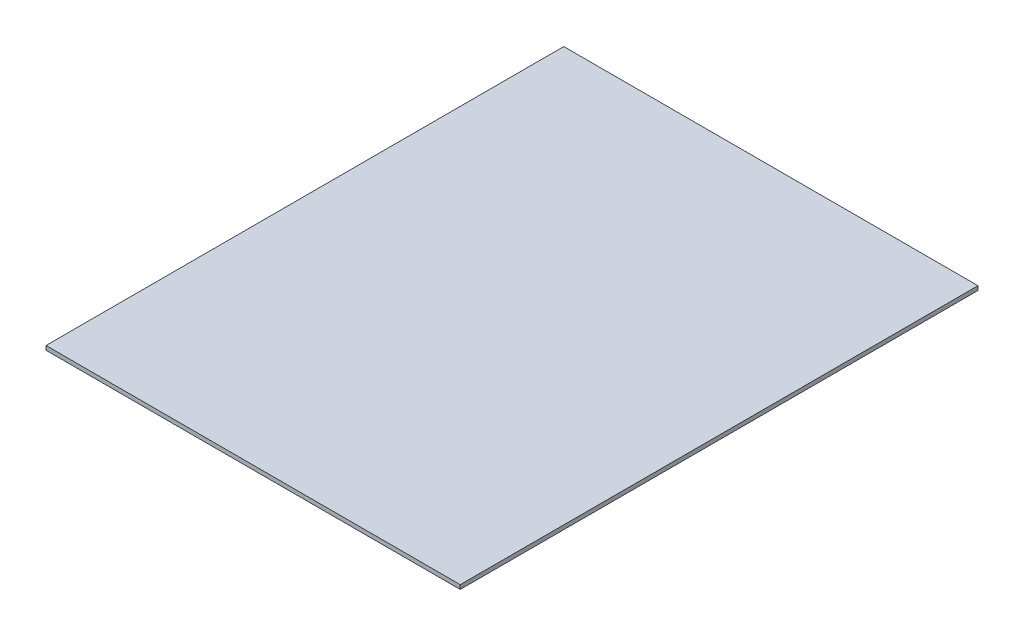
ISO-10303-21;
HEADER;
FILE_DESCRIPTION(('STEP AP214'),'2;1');
FILE_NAME('part.step','',(''),(''),'','','');
FILE_SCHEMA(('AUTOMOTIVE_DESIGN { 1 0 10303 214 1 1 1 1 }'));
ENDSEC;
DATA;
#1=APPLICATION_CONTEXT('core data for automotive mechanical design processes');
#2=APPLICATION_PROTOCOL_DEFINITION('international standard','automotive_design',2000,#1);
#3=PRODUCT_CONTEXT('',#1,'mechanical');
#4=PRODUCT('Part','Part','',(#3));
#5=PRODUCT_RELATED_PRODUCT_CATEGORY('part','',(#4));
#6=PRODUCT_DEFINITION_FORMATION('','',#4);
#7=PRODUCT_DEFINITION_CONTEXT('part definition',#1,'design');
#8=PRODUCT_DEFINITION('design','',#6,#7);
#9=PRODUCT_DEFINITION_SHAPE('','',#8);
#10=(LENGTH_UNIT() NAMED_UNIT(*) SI_UNIT(.MILLI.,.METRE.));
#11=(NAMED_UNIT(*) PLANE_ANGLE_UNIT() SI_UNIT($,.RADIAN.));
#12=(NAMED_UNIT(*) SI_UNIT($,.STERADIAN.) SOLID_ANGLE_UNIT());
#13=UNCERTAINTY_MEASURE_WITH_UNIT(LENGTH_MEASURE(1.E-05),#10,'distance_accuracy_value','');
#14=(GEOMETRIC_REPRESENTATION_CONTEXT(3) GLOBAL_UNCERTAINTY_ASSIGNED_CONTEXT((#13)) GLOBAL_UNIT_ASSIGNED_CONTEXT((#10,
#11,#12)) REPRESENTATION_CONTEXT('',''));
#15=CARTESIAN_POINT('',(0.,0.,0.));
#16=DIRECTION('',(0.,0.,1.));
#17=DIRECTION('',(1.,0.,0.));
#18=AXIS2_PLACEMENT_3D('',#15,#16,#17);
#19=CARTESIAN_POINT('',(150.,1166.,-560.));
#20=DIRECTION('',(-1.,0.,0.));
#21=DIRECTION('',(0.,0.,1.));
#22=AXIS2_PLACEMENT_3D('',#19,#20,#21);
#23=PLANE('',#22);
#24=DIRECTION('',(0.,-1.,0.));
#25=VECTOR('',#24,1.);
#26=CARTESIAN_POINT('',(150.,1166.,-60.));
#27=LINE('',#26,#25);
#28=CARTESIAN_POINT('',(150.,1170.,-60.));
#29=VERTEX_POINT('',#28);
#30=CARTESIAN_POINT('',(150.,1166.,-60.));
#31=VERTEX_POINT('',#30);
#32=EDGE_CURVE('E103',#29,#31,#27,.T.);
#33=ORIENTED_EDGE('',*,*,#32,.F.);
#34=DIRECTION('',(0.,0.,1.));
#35=VECTOR('',#34,1.);
#36=CARTESIAN_POINT('',(150.,1170.,-560.));
#37=LINE('',#36,#35);
#38=CARTESIAN_POINT('',(150.,1170.,-560.));
#39=VERTEX_POINT('',#38);
#40=EDGE_CURVE('E11',#39,#29,#37,.T.);
#41=ORIENTED_EDGE('',*,*,#40,.F.);
#42=DIRECTION('',(0.,-1.,0.));
#43=VECTOR('',#42,1.);
#44=CARTESIAN_POINT('',(150.,1166.,-560.));
#45=LINE('',#44,#43);
#46=CARTESIAN_POINT('',(150.,1166.,-560.));
#47=VERTEX_POINT('',#46);
#48=EDGE_CURVE('E97',#39,#47,#45,.T.);
#49=ORIENTED_EDGE('',*,*,#48,.T.);
#50=DIRECTION('',(0.,0.,1.));
#51=VECTOR('',#50,1.);
#52=CARTESIAN_POINT('',(150.,1166.,-560.));
#53=LINE('',#52,#51);
#54=EDGE_CURVE('E42',#47,#31,#53,.T.);
#55=ORIENTED_EDGE('',*,*,#54,.T.);
#56=EDGE_LOOP('',(#33,#41,#49,#55));
#57=FACE_BOUND('',#56,.T.);
#58=ADVANCED_FACE('F39',(#57),#23,.T.);
#59=CARTESIAN_POINT('',(150.,1170.,-560.));
#60=DIRECTION('',(0.,1.,0.));
#61=DIRECTION('',(0.,0.,1.));
#62=AXIS2_PLACEMENT_3D('',#59,#60,#61);
#63=PLANE('',#62);
#64=DIRECTION('',(-1.,0.,0.));
#65=VECTOR('',#64,1.);
#66=CARTESIAN_POINT('',(150.,1170.,-60.));
#67=LINE('',#66,#65);
#68=CARTESIAN_POINT('',(550.,1170.,-60.));
#69=VERTEX_POINT('',#68);
#70=EDGE_CURVE('E99',#69,#29,#67,.T.);
#71=ORIENTED_EDGE('',*,*,#70,.F.);
#72=DIRECTION('',(0.,0.,1.));
#73=VECTOR('',#72,1.);
#74=CARTESIAN_POINT('',(550.,1170.,-560.));
#75=LINE('',#74,#73);
#76=CARTESIAN_POINT('',(550.,1170.,-560.));
#77=VERTEX_POINT('',#76);
#78=EDGE_CURVE('E48',#77,#69,#75,.T.);
#79=ORIENTED_EDGE('',*,*,#78,.F.);
#80=DIRECTION('',(-1.,0.,0.));
#81=VECTOR('',#80,1.);
#82=CARTESIAN_POINT('',(150.,1170.,-560.));
#83=LINE('',#82,#81);
#84=EDGE_CURVE('E94',#77,#39,#83,.T.);
#85=ORIENTED_EDGE('',*,*,#84,.T.);
#86=ORIENTED_EDGE('',*,*,#40,.T.);
#87=EDGE_LOOP('',(#71,#79,#85,#86));
#88=FACE_BOUND('',#87,.T.);
#89=ADVANCED_FACE('F113',(#88),#63,.T.);
#90=CARTESIAN_POINT('',(550.,1166.,-560.));
#91=DIRECTION('',(1.,0.,0.));
#92=DIRECTION('',(0.,0.,-1.));
#93=AXIS2_PLACEMENT_3D('',#90,#91,#92);
#94=PLANE('',#93);
#95=DIRECTION('',(0.,1.,0.));
#96=VECTOR('',#95,1.);
#97=CARTESIAN_POINT('',(550.,1166.,-60.));
#98=LINE('',#97,#96);
#99=CARTESIAN_POINT('',(550.,1166.,-60.));
#100=VERTEX_POINT('',#99);
#101=EDGE_CURVE('E89',#100,#69,#98,.T.);
#102=ORIENTED_EDGE('',*,*,#101,.F.);
#103=DIRECTION('',(0.,0.,1.));
#104=VECTOR('',#103,1.);
#105=CARTESIAN_POINT('',(550.,1166.,-560.));
#106=LINE('',#105,#104);
#107=CARTESIAN_POINT('',(550.,1166.,-560.));
#108=VERTEX_POINT('',#107);
#109=EDGE_CURVE('E84',#108,#100,#106,.T.);
#110=ORIENTED_EDGE('',*,*,#109,.F.);
#111=DIRECTION('',(0.,1.,0.));
#112=VECTOR('',#111,1.);
#113=CARTESIAN_POINT('',(550.,1166.,-560.));
#114=LINE('',#113,#112);
#115=EDGE_CURVE('E87',#108,#77,#114,.T.);
#116=ORIENTED_EDGE('',*,*,#115,.T.);
#117=ORIENTED_EDGE('',*,*,#78,.T.);
#118=EDGE_LOOP('',(#102,#110,#116,#117));
#119=FACE_BOUND('',#118,.T.);
#120=ADVANCED_FACE('F86',(#119),#94,.T.);
#121=CARTESIAN_POINT('',(150.,1166.,-560.));
#122=DIRECTION('',(0.,-1.,0.));
#123=DIRECTION('',(0.,0.,-1.));
#124=AXIS2_PLACEMENT_3D('',#121,#122,#123);
#125=PLANE('',#124);
#126=DIRECTION('',(1.,0.,0.));
#127=VECTOR('',#126,1.);
#128=CARTESIAN_POINT('',(150.,1166.,-60.));
#129=LINE('',#128,#127);
#130=EDGE_CURVE('E106',#31,#100,#129,.T.);
#131=ORIENTED_EDGE('',*,*,#130,.F.);
#132=ORIENTED_EDGE('',*,*,#54,.F.);
#133=DIRECTION('',(1.,0.,0.));
#134=VECTOR('',#133,1.);
#135=CARTESIAN_POINT('',(150.,1166.,-560.));
#136=LINE('',#135,#134);
#137=EDGE_CURVE('E93',#47,#108,#136,.T.);
#138=ORIENTED_EDGE('',*,*,#137,.T.);
#139=ORIENTED_EDGE('',*,*,#109,.T.);
#140=EDGE_LOOP('',(#131,#132,#138,#139));
#141=FACE_BOUND('',#140,.T.);
#142=ADVANCED_FACE('F96',(#141),#125,.T.);
#143=CARTESIAN_POINT('',(0.,0.,-560.));
#144=DIRECTION('',(0.,0.,-1.));
#145=DIRECTION('',(-1.,0.,0.));
#146=AXIS2_PLACEMENT_3D('',#143,#144,#145);
#147=PLANE('',#146);
#148=ORIENTED_EDGE('',*,*,#48,.F.);
#149=ORIENTED_EDGE('',*,*,#84,.F.);
#150=ORIENTED_EDGE('',*,*,#115,.F.);
#151=ORIENTED_EDGE('',*,*,#137,.F.);
#152=EDGE_LOOP('',(#148,#149,#150,#151));
#153=FACE_BOUND('',#152,.T.);
#154=ADVANCED_FACE('F92',(#153),#147,.T.);
#155=CARTESIAN_POINT('',(0.,0.,-60.));
#156=DIRECTION('',(0.,0.,-1.));
#157=DIRECTION('',(-1.,0.,0.));
#158=AXIS2_PLACEMENT_3D('',#155,#156,#157);
#159=PLANE('',#158);
#160=ORIENTED_EDGE('',*,*,#32,.T.);
#161=ORIENTED_EDGE('',*,*,#130,.T.);
#162=ORIENTED_EDGE('',*,*,#101,.T.);
#163=ORIENTED_EDGE('',*,*,#70,.T.);
#164=EDGE_LOOP('',(#160,#161,#162,#163));
#165=FACE_BOUND('',#164,.T.);
#166=ADVANCED_FACE('F112',(#165),#159,.F.);
#167=CLOSED_SHELL('',(#58,#89,#120,#142,#154,#166));
#168=MANIFOLD_SOLID_BREP('B2',#167);
#169=ADVANCED_BREP_SHAPE_REPRESENTATION('',(#18,#168),#14);
#170=SHAPE_DEFINITION_REPRESENTATION(#9,#169);
ENDSEC;
END-ISO-10303-21;
